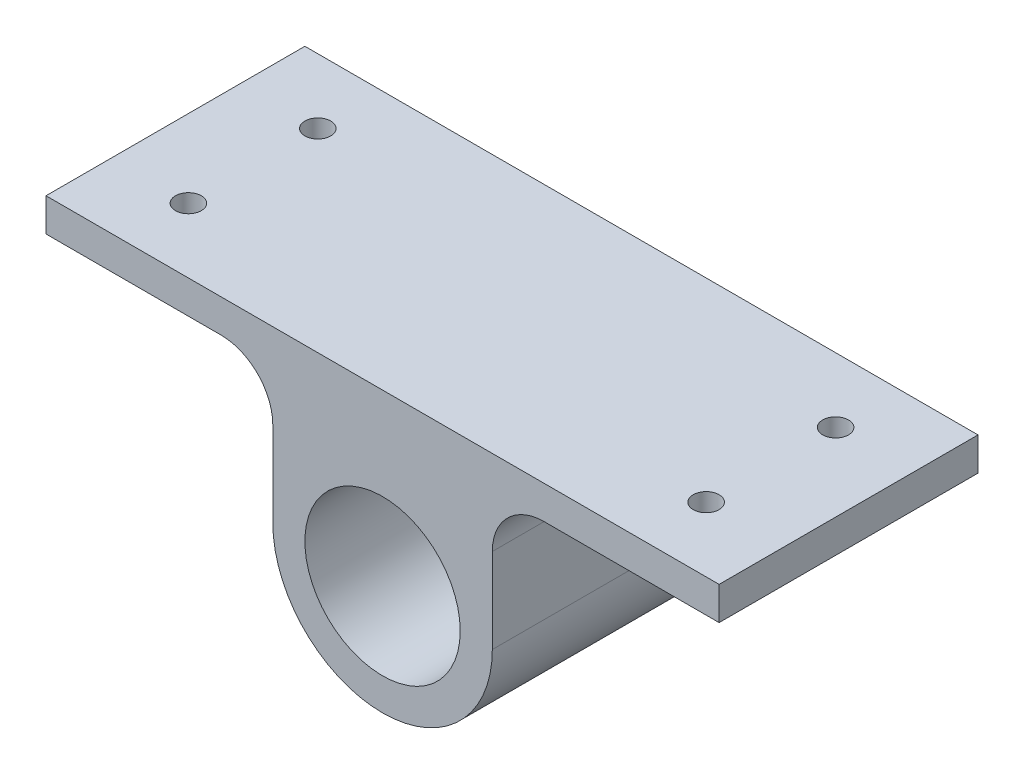
ISO-10303-21;
HEADER;
FILE_DESCRIPTION(('STEP AP214'),'2;1');
FILE_NAME('part.step','',(''),(''),'','','');
FILE_SCHEMA(('AUTOMOTIVE_DESIGN { 1 0 10303 214 1 1 1 1 }'));
ENDSEC;
DATA;
#1=APPLICATION_CONTEXT('core data for automotive mechanical design processes');
#2=APPLICATION_PROTOCOL_DEFINITION('international standard','automotive_design',2000,#1);
#3=PRODUCT_CONTEXT('',#1,'mechanical');
#4=PRODUCT('Part','Part','',(#3));
#5=PRODUCT_RELATED_PRODUCT_CATEGORY('part','',(#4));
#6=PRODUCT_DEFINITION_FORMATION('','',#4);
#7=PRODUCT_DEFINITION_CONTEXT('part definition',#1,'design');
#8=PRODUCT_DEFINITION('design','',#6,#7);
#9=PRODUCT_DEFINITION_SHAPE('','',#8);
#10=(LENGTH_UNIT() NAMED_UNIT(*) SI_UNIT(.MILLI.,.METRE.));
#11=(NAMED_UNIT(*) PLANE_ANGLE_UNIT() SI_UNIT($,.RADIAN.));
#12=(NAMED_UNIT(*) SI_UNIT($,.STERADIAN.) SOLID_ANGLE_UNIT());
#13=UNCERTAINTY_MEASURE_WITH_UNIT(LENGTH_MEASURE(1.E-05),#10,'distance_accuracy_value','');
#14=(GEOMETRIC_REPRESENTATION_CONTEXT(3) GLOBAL_UNCERTAINTY_ASSIGNED_CONTEXT((#13)) GLOBAL_UNIT_ASSIGNED_CONTEXT((#10,
#11,#12)) REPRESENTATION_CONTEXT('',''));
#15=CARTESIAN_POINT('',(0.,0.,0.));
#16=DIRECTION('',(0.,0.,1.));
#17=DIRECTION('',(1.,0.,0.));
#18=AXIS2_PLACEMENT_3D('',#15,#16,#17);
#19=CARTESIAN_POINT('',(0.,0.,125.));
#20=DIRECTION('',(0.,0.,1.));
#21=DIRECTION('',(1.,0.,0.));
#22=AXIS2_PLACEMENT_3D('',#19,#20,#21);
#23=PLANE('',#22);
#24=DIRECTION('',(1.,0.,0.));
#25=VECTOR('',#24,1.);
#26=CARTESIAN_POINT('',(-106.,132.,125.));
#27=LINE('',#26,#25);
#28=CARTESIAN_POINT('',(-325.,132.,125.));
#29=VERTEX_POINT('',#28);
#30=CARTESIAN_POINT('',(-156.,132.,125.));
#31=VERTEX_POINT('',#30);
#32=EDGE_CURVE('E124',#29,#31,#27,.T.);
#33=ORIENTED_EDGE('',*,*,#32,.T.);
#34=CARTESIAN_POINT('',(-156.,82.,125.));
#35=DIRECTION('',(0.,0.,1.));
#36=DIRECTION('',(1.,0.,0.));
#37=AXIS2_PLACEMENT_3D('',#34,#35,#36);
#38=CIRCLE('',#37,50.);
#39=CARTESIAN_POINT('',(-106.,82.,125.));
#40=VERTEX_POINT('',#39);
#41=EDGE_CURVE('E120',#31,#40,#38,.F.);
#42=ORIENTED_EDGE('',*,*,#41,.T.);
#43=DIRECTION('',(0.,-1.,0.));
#44=VECTOR('',#43,1.);
#45=CARTESIAN_POINT('',(-106.,0.,125.));
#46=LINE('',#45,#44);
#47=CARTESIAN_POINT('',(-106.,0.,125.));
#48=VERTEX_POINT('',#47);
#49=EDGE_CURVE('E112',#40,#48,#46,.T.);
#50=ORIENTED_EDGE('',*,*,#49,.T.);
#51=CARTESIAN_POINT('',(0.,0.,125.));
#52=DIRECTION('',(0.,0.,1.));
#53=DIRECTION('',(1.,0.,0.));
#54=AXIS2_PLACEMENT_3D('',#51,#52,#53);
#55=CIRCLE('',#54,106.);
#56=CARTESIAN_POINT('',(106.,0.,125.));
#57=VERTEX_POINT('',#56);
#58=EDGE_CURVE('E117',#48,#57,#55,.T.);
#59=ORIENTED_EDGE('',*,*,#58,.T.);
#60=DIRECTION('',(0.,1.,0.));
#61=VECTOR('',#60,1.);
#62=CARTESIAN_POINT('',(106.,0.,125.));
#63=LINE('',#62,#61);
#64=CARTESIAN_POINT('',(106.,81.9999999999999,125.));
#65=VERTEX_POINT('',#64);
#66=EDGE_CURVE('E138',#57,#65,#63,.T.);
#67=ORIENTED_EDGE('',*,*,#66,.T.);
#68=CARTESIAN_POINT('',(156.,81.9999999999999,125.));
#69=DIRECTION('',(0.,0.,1.));
#70=DIRECTION('',(1.,0.,0.));
#71=AXIS2_PLACEMENT_3D('',#68,#69,#70);
#72=CIRCLE('',#71,50.);
#73=CARTESIAN_POINT('',(156.,132.,125.));
#74=VERTEX_POINT('',#73);
#75=EDGE_CURVE('E11',#65,#74,#72,.F.);
#76=ORIENTED_EDGE('',*,*,#75,.T.);
#77=DIRECTION('',(1.,0.,0.));
#78=VECTOR('',#77,1.);
#79=CARTESIAN_POINT('',(106.,132.,125.));
#80=LINE('',#79,#78);
#81=CARTESIAN_POINT('',(325.,132.,125.));
#82=VERTEX_POINT('',#81);
#83=EDGE_CURVE('E140',#74,#82,#80,.T.);
#84=ORIENTED_EDGE('',*,*,#83,.T.);
#85=DIRECTION('',(0.,1.,0.));
#86=VECTOR('',#85,1.);
#87=CARTESIAN_POINT('',(325.,132.,125.));
#88=LINE('',#87,#86);
#89=CARTESIAN_POINT('',(325.,164.,125.));
#90=VERTEX_POINT('',#89);
#91=EDGE_CURVE('E145',#82,#90,#88,.T.);
#92=ORIENTED_EDGE('',*,*,#91,.T.);
#93=DIRECTION('',(-1.,0.,0.));
#94=VECTOR('',#93,1.);
#95=CARTESIAN_POINT('',(-325.,164.,125.));
#96=LINE('',#95,#94);
#97=CARTESIAN_POINT('',(-325.,164.,125.));
#98=VERTEX_POINT('',#97);
#99=EDGE_CURVE('E147',#90,#98,#96,.T.);
#100=ORIENTED_EDGE('',*,*,#99,.T.);
#101=DIRECTION('',(0.,-1.,0.));
#102=VECTOR('',#101,1.);
#103=CARTESIAN_POINT('',(-325.,132.,125.));
#104=LINE('',#103,#102);
#105=EDGE_CURVE('E149',#98,#29,#104,.T.);
#106=ORIENTED_EDGE('',*,*,#105,.T.);
#107=EDGE_LOOP('',(#33,#42,#50,#59,#67,#76,#84,#92,#100,#106));
#108=FACE_BOUND('',#107,.T.);
#109=CARTESIAN_POINT('',(0.,0.,125.));
#110=DIRECTION('',(0.,0.,1.));
#111=DIRECTION('',(1.,0.,0.));
#112=AXIS2_PLACEMENT_3D('',#109,#110,#111);
#113=CIRCLE('',#112,75.);
#114=CARTESIAN_POINT('',(75.,0.,125.));
#115=VERTEX_POINT('',#114);
#116=EDGE_CURVE('E155',#115,#115,#113,.T.);
#117=ORIENTED_EDGE('',*,*,#116,.F.);
#118=EDGE_LOOP('',(#117));
#119=FACE_BOUND('',#118,.T.);
#120=ADVANCED_FACE('F36',(#108,#119),#23,.T.);
#121=CARTESIAN_POINT('',(0.,0.,-125.));
#122=DIRECTION('',(0.,0.,1.));
#123=DIRECTION('',(1.,0.,0.));
#124=AXIS2_PLACEMENT_3D('',#121,#122,#123);
#125=PLANE('',#124);
#126=DIRECTION('',(1.,0.,0.));
#127=VECTOR('',#126,1.);
#128=CARTESIAN_POINT('',(-106.,132.,-125.));
#129=LINE('',#128,#127);
#130=CARTESIAN_POINT('',(-325.,132.,-125.));
#131=VERTEX_POINT('',#130);
#132=CARTESIAN_POINT('',(-156.,132.,-125.));
#133=VERTEX_POINT('',#132);
#134=EDGE_CURVE('E152',#131,#133,#129,.T.);
#135=ORIENTED_EDGE('',*,*,#134,.F.);
#136=DIRECTION('',(0.,-1.,0.));
#137=VECTOR('',#136,1.);
#138=CARTESIAN_POINT('',(-325.,132.,-125.));
#139=LINE('',#138,#137);
#140=CARTESIAN_POINT('',(-325.,164.,-125.));
#141=VERTEX_POINT('',#140);
#142=EDGE_CURVE('E167',#141,#131,#139,.T.);
#143=ORIENTED_EDGE('',*,*,#142,.F.);
#144=DIRECTION('',(-1.,0.,0.));
#145=VECTOR('',#144,1.);
#146=CARTESIAN_POINT('',(-325.,164.,-125.));
#147=LINE('',#146,#145);
#148=CARTESIAN_POINT('',(325.,164.,-125.));
#149=VERTEX_POINT('',#148);
#150=EDGE_CURVE('E165',#149,#141,#147,.T.);
#151=ORIENTED_EDGE('',*,*,#150,.F.);
#152=DIRECTION('',(0.,1.,0.));
#153=VECTOR('',#152,1.);
#154=CARTESIAN_POINT('',(325.,132.,-125.));
#155=LINE('',#154,#153);
#156=CARTESIAN_POINT('',(325.,132.,-125.));
#157=VERTEX_POINT('',#156);
#158=EDGE_CURVE('E163',#157,#149,#155,.T.);
#159=ORIENTED_EDGE('',*,*,#158,.F.);
#160=DIRECTION('',(1.,0.,0.));
#161=VECTOR('',#160,1.);
#162=CARTESIAN_POINT('',(106.,132.,-125.));
#163=LINE('',#162,#161);
#164=CARTESIAN_POINT('',(156.,132.,-125.));
#165=VERTEX_POINT('',#164);
#166=EDGE_CURVE('E161',#165,#157,#163,.T.);
#167=ORIENTED_EDGE('',*,*,#166,.F.);
#168=CARTESIAN_POINT('',(156.,81.9999999999999,-125.));
#169=DIRECTION('',(0.,0.,1.));
#170=DIRECTION('',(1.,0.,0.));
#171=AXIS2_PLACEMENT_3D('',#168,#169,#170);
#172=CIRCLE('',#171,50.);
#173=CARTESIAN_POINT('',(106.,81.9999999999999,-125.));
#174=VERTEX_POINT('',#173);
#175=EDGE_CURVE('E44',#165,#174,#172,.T.);
#176=ORIENTED_EDGE('',*,*,#175,.T.);
#177=DIRECTION('',(0.,1.,0.));
#178=VECTOR('',#177,1.);
#179=CARTESIAN_POINT('',(106.,0.,-125.));
#180=LINE('',#179,#178);
#181=CARTESIAN_POINT('',(106.,0.,-125.));
#182=VERTEX_POINT('',#181);
#183=EDGE_CURVE('E159',#182,#174,#180,.T.);
#184=ORIENTED_EDGE('',*,*,#183,.F.);
#185=CARTESIAN_POINT('',(0.,0.,-125.));
#186=DIRECTION('',(0.,0.,1.));
#187=DIRECTION('',(1.,0.,0.));
#188=AXIS2_PLACEMENT_3D('',#185,#186,#187);
#189=CIRCLE('',#188,106.);
#190=CARTESIAN_POINT('',(-106.,0.,-125.));
#191=VERTEX_POINT('',#190);
#192=EDGE_CURVE('E157',#191,#182,#189,.T.);
#193=ORIENTED_EDGE('',*,*,#192,.F.);
#194=DIRECTION('',(0.,-1.,0.));
#195=VECTOR('',#194,1.);
#196=CARTESIAN_POINT('',(-106.,0.,-125.));
#197=LINE('',#196,#195);
#198=CARTESIAN_POINT('',(-106.,82.,-125.));
#199=VERTEX_POINT('',#198);
#200=EDGE_CURVE('E130',#199,#191,#197,.T.);
#201=ORIENTED_EDGE('',*,*,#200,.F.);
#202=CARTESIAN_POINT('',(-156.,82.,-125.));
#203=DIRECTION('',(0.,0.,1.));
#204=DIRECTION('',(1.,0.,0.));
#205=AXIS2_PLACEMENT_3D('',#202,#203,#204);
#206=CIRCLE('',#205,50.);
#207=EDGE_CURVE('E188',#199,#133,#206,.T.);
#208=ORIENTED_EDGE('',*,*,#207,.T.);
#209=EDGE_LOOP('',(#135,#143,#151,#159,#167,#176,#184,#193,#201,#208));
#210=FACE_BOUND('',#209,.T.);
#211=CARTESIAN_POINT('',(0.,0.,-125.));
#212=DIRECTION('',(0.,0.,1.));
#213=DIRECTION('',(1.,0.,0.));
#214=AXIS2_PLACEMENT_3D('',#211,#212,#213);
#215=CIRCLE('',#214,75.);
#216=CARTESIAN_POINT('',(75.,0.,-125.));
#217=VERTEX_POINT('',#216);
#218=EDGE_CURVE('E268',#217,#217,#215,.T.);
#219=ORIENTED_EDGE('',*,*,#218,.T.);
#220=EDGE_LOOP('',(#219));
#221=FACE_BOUND('',#220,.T.);
#222=ADVANCED_FACE('F191',(#210,#221),#125,.F.);
#223=CARTESIAN_POINT('',(-106.,132.,125.));
#224=DIRECTION('',(0.,1.,0.));
#225=DIRECTION('',(-1.,0.,0.));
#226=AXIS2_PLACEMENT_3D('',#223,#224,#225);
#227=PLANE('',#226);
#228=CARTESIAN_POINT('',(-250.,132.,62.5));
#229=DIRECTION('',(0.,1.,0.));
#230=DIRECTION('',(-1.,0.,0.));
#231=AXIS2_PLACEMENT_3D('',#228,#229,#230);
#232=CIRCLE('',#231,12.5);
#233=CARTESIAN_POINT('',(-262.5,132.,62.5));
#234=VERTEX_POINT('',#233);
#235=EDGE_CURVE('E249',#234,#234,#232,.T.);
#236=ORIENTED_EDGE('',*,*,#235,.T.);
#237=EDGE_LOOP('',(#236));
#238=FACE_BOUND('',#237,.T.);
#239=CARTESIAN_POINT('',(-250.,132.,-62.5));
#240=DIRECTION('',(0.,1.,0.));
#241=DIRECTION('',(-1.,0.,0.));
#242=AXIS2_PLACEMENT_3D('',#239,#240,#241);
#243=CIRCLE('',#242,12.5);
#244=CARTESIAN_POINT('',(-262.5,132.,-62.5));
#245=VERTEX_POINT('',#244);
#246=EDGE_CURVE('E252',#245,#245,#243,.T.);
#247=ORIENTED_EDGE('',*,*,#246,.T.);
#248=EDGE_LOOP('',(#247));
#249=FACE_BOUND('',#248,.T.);
#250=ORIENTED_EDGE('',*,*,#134,.T.);
#251=DIRECTION('',(0.,0.,-1.));
#252=VECTOR('',#251,1.);
#253=CARTESIAN_POINT('',(-156.,132.,125.));
#254=LINE('',#253,#252);
#255=EDGE_CURVE('E182',#133,#31,#254,.F.);
#256=ORIENTED_EDGE('',*,*,#255,.T.);
#257=ORIENTED_EDGE('',*,*,#32,.F.);
#258=DIRECTION('',(0.,0.,-1.));
#259=VECTOR('',#258,1.);
#260=CARTESIAN_POINT('',(-325.,132.,125.));
#261=LINE('',#260,#259);
#262=EDGE_CURVE('E151',#29,#131,#261,.T.);
#263=ORIENTED_EDGE('',*,*,#262,.T.);
#264=EDGE_LOOP('',(#250,#256,#257,#263));
#265=FACE_BOUND('',#264,.T.);
#266=ADVANCED_FACE('F197',(#238,#249,#265),#227,.F.);
#267=CARTESIAN_POINT('',(-106.,0.,125.));
#268=DIRECTION('',(1.,0.,0.));
#269=DIRECTION('',(0.,1.,0.));
#270=AXIS2_PLACEMENT_3D('',#267,#268,#269);
#271=PLANE('',#270);
#272=ORIENTED_EDGE('',*,*,#49,.F.);
#273=DIRECTION('',(0.,0.,-1.));
#274=VECTOR('',#273,1.);
#275=CARTESIAN_POINT('',(-106.,82.,-125.));
#276=LINE('',#275,#274);
#277=EDGE_CURVE('E133',#40,#199,#276,.T.);
#278=ORIENTED_EDGE('',*,*,#277,.T.);
#279=ORIENTED_EDGE('',*,*,#200,.T.);
#280=DIRECTION('',(0.,0.,-1.));
#281=VECTOR('',#280,1.);
#282=CARTESIAN_POINT('',(-106.,0.,125.));
#283=LINE('',#282,#281);
#284=EDGE_CURVE('E127',#48,#191,#283,.T.);
#285=ORIENTED_EDGE('',*,*,#284,.F.);
#286=EDGE_LOOP('',(#272,#278,#279,#285));
#287=FACE_BOUND('',#286,.T.);
#288=ADVANCED_FACE('F128',(#287),#271,.F.);
#289=CARTESIAN_POINT('',(0.,0.,125.));
#290=DIRECTION('',(0.,0.,-1.));
#291=DIRECTION('',(-1.,0.,0.));
#292=AXIS2_PLACEMENT_3D('',#289,#290,#291);
#293=CYLINDRICAL_SURFACE('',#292,106.);
#294=ORIENTED_EDGE('',*,*,#192,.T.);
#295=DIRECTION('',(0.,0.,-1.));
#296=VECTOR('',#295,1.);
#297=CARTESIAN_POINT('',(106.,0.,125.));
#298=LINE('',#297,#296);
#299=EDGE_CURVE('E134',#57,#182,#298,.T.);
#300=ORIENTED_EDGE('',*,*,#299,.F.);
#301=ORIENTED_EDGE('',*,*,#58,.F.);
#302=ORIENTED_EDGE('',*,*,#284,.T.);
#303=EDGE_LOOP('',(#294,#300,#301,#302));
#304=FACE_BOUND('',#303,.T.);
#305=ADVANCED_FACE('F136',(#304),#293,.T.);
#306=CARTESIAN_POINT('',(106.,0.,125.));
#307=DIRECTION('',(-1.,0.,0.));
#308=DIRECTION('',(0.,-1.,0.));
#309=AXIS2_PLACEMENT_3D('',#306,#307,#308);
#310=PLANE('',#309);
#311=ORIENTED_EDGE('',*,*,#183,.T.);
#312=DIRECTION('',(0.,0.,-1.));
#313=VECTOR('',#312,1.);
#314=CARTESIAN_POINT('',(106.,81.9999999999999,125.));
#315=LINE('',#314,#313);
#316=EDGE_CURVE('E51',#174,#65,#315,.F.);
#317=ORIENTED_EDGE('',*,*,#316,.T.);
#318=ORIENTED_EDGE('',*,*,#66,.F.);
#319=ORIENTED_EDGE('',*,*,#299,.T.);
#320=EDGE_LOOP('',(#311,#317,#318,#319));
#321=FACE_BOUND('',#320,.T.);
#322=ADVANCED_FACE('F235',(#321),#310,.F.);
#323=CARTESIAN_POINT('',(106.,132.,125.));
#324=DIRECTION('',(0.,1.,0.));
#325=DIRECTION('',(-1.,0.,0.));
#326=AXIS2_PLACEMENT_3D('',#323,#324,#325);
#327=PLANE('',#326);
#328=CARTESIAN_POINT('',(250.,132.,-62.5));
#329=DIRECTION('',(0.,1.,0.));
#330=DIRECTION('',(-1.,0.,0.));
#331=AXIS2_PLACEMENT_3D('',#328,#329,#330);
#332=CIRCLE('',#331,12.5);
#333=CARTESIAN_POINT('',(237.5,132.,-62.5));
#334=VERTEX_POINT('',#333);
#335=EDGE_CURVE('E265',#334,#334,#332,.T.);
#336=ORIENTED_EDGE('',*,*,#335,.T.);
#337=EDGE_LOOP('',(#336));
#338=FACE_BOUND('',#337,.T.);
#339=CARTESIAN_POINT('',(250.,132.,62.5));
#340=DIRECTION('',(0.,1.,0.));
#341=DIRECTION('',(-1.,0.,0.));
#342=AXIS2_PLACEMENT_3D('',#339,#340,#341);
#343=CIRCLE('',#342,12.5);
#344=CARTESIAN_POINT('',(237.5,132.,62.5));
#345=VERTEX_POINT('',#344);
#346=EDGE_CURVE('E256',#345,#345,#343,.T.);
#347=ORIENTED_EDGE('',*,*,#346,.T.);
#348=EDGE_LOOP('',(#347));
#349=FACE_BOUND('',#348,.T.);
#350=ORIENTED_EDGE('',*,*,#83,.F.);
#351=DIRECTION('',(0.,0.,-1.));
#352=VECTOR('',#351,1.);
#353=CARTESIAN_POINT('',(156.,132.,-125.));
#354=LINE('',#353,#352);
#355=EDGE_CURVE('E184',#74,#165,#354,.T.);
#356=ORIENTED_EDGE('',*,*,#355,.T.);
#357=ORIENTED_EDGE('',*,*,#166,.T.);
#358=DIRECTION('',(0.,0.,-1.));
#359=VECTOR('',#358,1.);
#360=CARTESIAN_POINT('',(325.,132.,125.));
#361=LINE('',#360,#359);
#362=EDGE_CURVE('E177',#82,#157,#361,.T.);
#363=ORIENTED_EDGE('',*,*,#362,.F.);
#364=EDGE_LOOP('',(#350,#356,#357,#363));
#365=FACE_BOUND('',#364,.T.);
#366=ADVANCED_FACE('F231',(#338,#349,#365),#327,.F.);
#367=CARTESIAN_POINT('',(325.,132.,125.));
#368=DIRECTION('',(-1.,0.,0.));
#369=DIRECTION('',(0.,0.,1.));
#370=AXIS2_PLACEMENT_3D('',#367,#368,#369);
#371=PLANE('',#370);
#372=ORIENTED_EDGE('',*,*,#158,.T.);
#373=DIRECTION('',(0.,0.,-1.));
#374=VECTOR('',#373,1.);
#375=CARTESIAN_POINT('',(325.,164.,125.));
#376=LINE('',#375,#374);
#377=EDGE_CURVE('E174',#90,#149,#376,.T.);
#378=ORIENTED_EDGE('',*,*,#377,.F.);
#379=ORIENTED_EDGE('',*,*,#91,.F.);
#380=ORIENTED_EDGE('',*,*,#362,.T.);
#381=EDGE_LOOP('',(#372,#378,#379,#380));
#382=FACE_BOUND('',#381,.T.);
#383=ADVANCED_FACE('F227',(#382),#371,.F.);
#384=CARTESIAN_POINT('',(-325.,164.,125.));
#385=DIRECTION('',(0.,-1.,0.));
#386=DIRECTION('',(1.,0.,0.));
#387=AXIS2_PLACEMENT_3D('',#384,#385,#386);
#388=PLANE('',#387);
#389=CARTESIAN_POINT('',(250.,164.,-62.5));
#390=DIRECTION('',(0.,1.,0.));
#391=DIRECTION('',(1.,0.,0.));
#392=AXIS2_PLACEMENT_3D('',#389,#390,#391);
#393=CIRCLE('',#392,12.5);
#394=CARTESIAN_POINT('',(262.5,164.,-62.5));
#395=VERTEX_POINT('',#394);
#396=EDGE_CURVE('E321',#395,#395,#393,.T.);
#397=ORIENTED_EDGE('',*,*,#396,.F.);
#398=EDGE_LOOP('',(#397));
#399=FACE_BOUND('',#398,.T.);
#400=CARTESIAN_POINT('',(250.,164.,62.5));
#401=DIRECTION('',(0.,1.,0.));
#402=DIRECTION('',(1.,0.,0.));
#403=AXIS2_PLACEMENT_3D('',#400,#401,#402);
#404=CIRCLE('',#403,12.5);
#405=CARTESIAN_POINT('',(262.5,164.,62.5));
#406=VERTEX_POINT('',#405);
#407=EDGE_CURVE('E318',#406,#406,#404,.T.);
#408=ORIENTED_EDGE('',*,*,#407,.F.);
#409=EDGE_LOOP('',(#408));
#410=FACE_BOUND('',#409,.T.);
#411=CARTESIAN_POINT('',(-250.,164.,62.5));
#412=DIRECTION('',(0.,1.,0.));
#413=DIRECTION('',(-1.,0.,0.));
#414=AXIS2_PLACEMENT_3D('',#411,#412,#413);
#415=CIRCLE('',#414,12.5);
#416=CARTESIAN_POINT('',(-262.5,164.,62.5));
#417=VERTEX_POINT('',#416);
#418=EDGE_CURVE('E259',#417,#417,#415,.T.);
#419=ORIENTED_EDGE('',*,*,#418,.F.);
#420=EDGE_LOOP('',(#419));
#421=FACE_BOUND('',#420,.T.);
#422=CARTESIAN_POINT('',(-250.,164.,-62.5));
#423=DIRECTION('',(0.,1.,0.));
#424=DIRECTION('',(-1.,0.,0.));
#425=AXIS2_PLACEMENT_3D('',#422,#423,#424);
#426=CIRCLE('',#425,12.5);
#427=CARTESIAN_POINT('',(-262.5,164.,-62.5));
#428=VERTEX_POINT('',#427);
#429=EDGE_CURVE('E254',#428,#428,#426,.T.);
#430=ORIENTED_EDGE('',*,*,#429,.F.);
#431=EDGE_LOOP('',(#430));
#432=FACE_BOUND('',#431,.T.);
#433=ORIENTED_EDGE('',*,*,#150,.T.);
#434=DIRECTION('',(0.,0.,-1.));
#435=VECTOR('',#434,1.);
#436=CARTESIAN_POINT('',(-325.,164.,125.));
#437=LINE('',#436,#435);
#438=EDGE_CURVE('E171',#98,#141,#437,.T.);
#439=ORIENTED_EDGE('',*,*,#438,.F.);
#440=ORIENTED_EDGE('',*,*,#99,.F.);
#441=ORIENTED_EDGE('',*,*,#377,.T.);
#442=EDGE_LOOP('',(#433,#439,#440,#441));
#443=FACE_BOUND('',#442,.T.);
#444=ADVANCED_FACE('F223',(#399,#410,#421,#432,#443),#388,.F.);
#445=CARTESIAN_POINT('',(-325.,132.,125.));
#446=DIRECTION('',(1.,0.,0.));
#447=DIRECTION('',(0.,0.,-1.));
#448=AXIS2_PLACEMENT_3D('',#445,#446,#447);
#449=PLANE('',#448);
#450=ORIENTED_EDGE('',*,*,#142,.T.);
#451=ORIENTED_EDGE('',*,*,#262,.F.);
#452=ORIENTED_EDGE('',*,*,#105,.F.);
#453=ORIENTED_EDGE('',*,*,#438,.T.);
#454=EDGE_LOOP('',(#450,#451,#452,#453));
#455=FACE_BOUND('',#454,.T.);
#456=ADVANCED_FACE('F209',(#455),#449,.F.);
#457=CARTESIAN_POINT('',(0.,0.,125.));
#458=DIRECTION('',(0.,0.,-1.));
#459=DIRECTION('',(-1.,0.,0.));
#460=AXIS2_PLACEMENT_3D('',#457,#458,#459);
#461=CYLINDRICAL_SURFACE('',#460,75.);
#462=ORIENTED_EDGE('',*,*,#116,.T.);
#463=EDGE_LOOP('',(#462));
#464=FACE_BOUND('',#463,.T.);
#465=ORIENTED_EDGE('',*,*,#218,.F.);
#466=EDGE_LOOP('',(#465));
#467=FACE_BOUND('',#466,.T.);
#468=ADVANCED_FACE('F202',(#464,#467),#461,.F.);
#469=CARTESIAN_POINT('',(-156.,82.,125.));
#470=DIRECTION('',(0.,0.,1.));
#471=DIRECTION('',(1.,0.,0.));
#472=AXIS2_PLACEMENT_3D('',#469,#470,#471);
#473=CYLINDRICAL_SURFACE('',#472,50.);
#474=ORIENTED_EDGE('',*,*,#41,.F.);
#475=ORIENTED_EDGE('',*,*,#255,.F.);
#476=ORIENTED_EDGE('',*,*,#207,.F.);
#477=ORIENTED_EDGE('',*,*,#277,.F.);
#478=EDGE_LOOP('',(#474,#475,#476,#477));
#479=FACE_BOUND('',#478,.T.);
#480=ADVANCED_FACE('F200',(#479),#473,.F.);
#481=CARTESIAN_POINT('',(156.,81.9999999999999,125.));
#482=DIRECTION('',(0.,0.,1.));
#483=DIRECTION('',(1.,0.,0.));
#484=AXIS2_PLACEMENT_3D('',#481,#482,#483);
#485=CYLINDRICAL_SURFACE('',#484,50.);
#486=ORIENTED_EDGE('',*,*,#75,.F.);
#487=ORIENTED_EDGE('',*,*,#316,.F.);
#488=ORIENTED_EDGE('',*,*,#175,.F.);
#489=ORIENTED_EDGE('',*,*,#355,.F.);
#490=EDGE_LOOP('',(#486,#487,#488,#489));
#491=FACE_BOUND('',#490,.T.);
#492=ADVANCED_FACE('F38',(#491),#485,.F.);
#493=CARTESIAN_POINT('',(-250.,-106.,-62.5));
#494=DIRECTION('',(0.,1.,0.));
#495=DIRECTION('',(-1.,0.,0.));
#496=AXIS2_PLACEMENT_3D('',#493,#494,#495);
#497=CYLINDRICAL_SURFACE('',#496,12.5);
#498=ORIENTED_EDGE('',*,*,#429,.T.);
#499=EDGE_LOOP('',(#498));
#500=FACE_BOUND('',#499,.T.);
#501=ORIENTED_EDGE('',*,*,#246,.F.);
#502=EDGE_LOOP('',(#501));
#503=FACE_BOUND('',#502,.T.);
#504=ADVANCED_FACE('F207',(#500,#503),#497,.F.);
#505=CARTESIAN_POINT('',(-250.,-106.,62.5));
#506=DIRECTION('',(0.,1.,0.));
#507=DIRECTION('',(-1.,0.,0.));
#508=AXIS2_PLACEMENT_3D('',#505,#506,#507);
#509=CYLINDRICAL_SURFACE('',#508,12.5);
#510=ORIENTED_EDGE('',*,*,#418,.T.);
#511=EDGE_LOOP('',(#510));
#512=FACE_BOUND('',#511,.T.);
#513=ORIENTED_EDGE('',*,*,#235,.F.);
#514=EDGE_LOOP('',(#513));
#515=FACE_BOUND('',#514,.T.);
#516=ADVANCED_FACE('F299',(#512,#515),#509,.F.);
#517=CARTESIAN_POINT('',(250.,-106.,62.5));
#518=DIRECTION('',(0.,1.,0.));
#519=DIRECTION('',(-1.,0.,0.));
#520=AXIS2_PLACEMENT_3D('',#517,#518,#519);
#521=CYLINDRICAL_SURFACE('',#520,12.5);
#522=ORIENTED_EDGE('',*,*,#407,.T.);
#523=EDGE_LOOP('',(#522));
#524=FACE_BOUND('',#523,.T.);
#525=ORIENTED_EDGE('',*,*,#346,.F.);
#526=EDGE_LOOP('',(#525));
#527=FACE_BOUND('',#526,.T.);
#528=ADVANCED_FACE('F293',(#524,#527),#521,.F.);
#529=CARTESIAN_POINT('',(250.,-106.,-62.5));
#530=DIRECTION('',(0.,1.,0.));
#531=DIRECTION('',(-1.,0.,0.));
#532=AXIS2_PLACEMENT_3D('',#529,#530,#531);
#533=CYLINDRICAL_SURFACE('',#532,12.5);
#534=ORIENTED_EDGE('',*,*,#396,.T.);
#535=EDGE_LOOP('',(#534));
#536=FACE_BOUND('',#535,.T.);
#537=ORIENTED_EDGE('',*,*,#335,.F.);
#538=EDGE_LOOP('',(#537));
#539=FACE_BOUND('',#538,.T.);
#540=ADVANCED_FACE('F291',(#536,#539),#533,.F.);
#541=CLOSED_SHELL('',(#120,#222,#266,#288,#305,#322,#366,#383,#444,#456,#468,#480,#492,#504,
#516,#528,#540));
#542=MANIFOLD_SOLID_BREP('B2',#541);
#543=ADVANCED_BREP_SHAPE_REPRESENTATION('',(#18,#542),#14);
#544=SHAPE_DEFINITION_REPRESENTATION(#9,#543);
ENDSEC;
END-ISO-10303-21;
